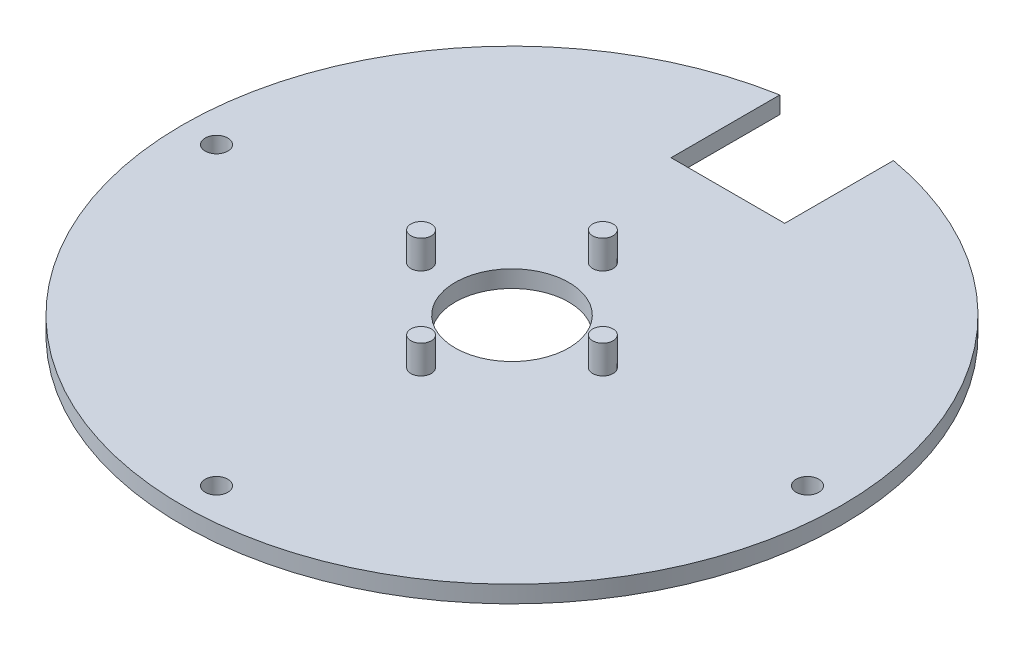
ISO-10303-21;
HEADER;
FILE_DESCRIPTION(('STEP AP214'),'2;1');
FILE_NAME('part.step','',(''),(''),'','','');
FILE_SCHEMA(('AUTOMOTIVE_DESIGN { 1 0 10303 214 1 1 1 1 }'));
ENDSEC;
DATA;
#1=APPLICATION_CONTEXT('core data for automotive mechanical design processes');
#2=APPLICATION_PROTOCOL_DEFINITION('international standard','automotive_design',2000,#1);
#3=PRODUCT_CONTEXT('',#1,'mechanical');
#4=PRODUCT('Part','Part','',(#3));
#5=PRODUCT_RELATED_PRODUCT_CATEGORY('part','',(#4));
#6=PRODUCT_DEFINITION_FORMATION('','',#4);
#7=PRODUCT_DEFINITION_CONTEXT('part definition',#1,'design');
#8=PRODUCT_DEFINITION('design','',#6,#7);
#9=PRODUCT_DEFINITION_SHAPE('','',#8);
#10=(LENGTH_UNIT() NAMED_UNIT(*) SI_UNIT(.MILLI.,.METRE.));
#11=(NAMED_UNIT(*) PLANE_ANGLE_UNIT() SI_UNIT($,.RADIAN.));
#12=(NAMED_UNIT(*) SI_UNIT($,.STERADIAN.) SOLID_ANGLE_UNIT());
#13=UNCERTAINTY_MEASURE_WITH_UNIT(LENGTH_MEASURE(1.E-05),#10,'distance_accuracy_value','');
#14=(GEOMETRIC_REPRESENTATION_CONTEXT(3) GLOBAL_UNCERTAINTY_ASSIGNED_CONTEXT((#13)) GLOBAL_UNIT_ASSIGNED_CONTEXT((#10,
#11,#12)) REPRESENTATION_CONTEXT('',''));
#15=CARTESIAN_POINT('',(0.,0.,0.));
#16=DIRECTION('',(0.,0.,1.));
#17=DIRECTION('',(1.,0.,0.));
#18=AXIS2_PLACEMENT_3D('',#15,#16,#17);
#19=CARTESIAN_POINT('',(0.,5.,0.));
#20=DIRECTION('',(0.,-1.,0.));
#21=DIRECTION('',(0.,0.,-1.));
#22=AXIS2_PLACEMENT_3D('',#19,#20,#21);
#23=CYLINDRICAL_SURFACE('',#22,29.);
#24=CARTESIAN_POINT('',(0.,3.5,0.));
#25=DIRECTION('',(0.,-1.,0.));
#26=DIRECTION('',(0.,0.,-1.));
#27=AXIS2_PLACEMENT_3D('',#24,#25,#26);
#28=CIRCLE('',#27,29.);
#29=CARTESIAN_POINT('',(5.,3.5,-28.5657137141714));
#30=VERTEX_POINT('',#29);
#31=CARTESIAN_POINT('',(-5.,3.5,-28.5657137141714));
#32=VERTEX_POINT('',#31);
#33=EDGE_CURVE('E75',#30,#32,#28,.T.);
#34=ORIENTED_EDGE('',*,*,#33,.F.);
#35=DIRECTION('',(0.,-1.,0.));
#36=VECTOR('',#35,1.);
#37=CARTESIAN_POINT('',(5.,5.,-28.5657137141714));
#38=LINE('',#37,#36);
#39=CARTESIAN_POINT('',(5.,5.,-28.5657137141714));
#40=VERTEX_POINT('',#39);
#41=EDGE_CURVE('E54',#30,#40,#38,.F.);
#42=ORIENTED_EDGE('',*,*,#41,.T.);
#43=CARTESIAN_POINT('',(0.,5.,0.));
#44=DIRECTION('',(0.,1.,0.));
#45=DIRECTION('',(0.,0.,1.));
#46=AXIS2_PLACEMENT_3D('',#43,#44,#45);
#47=CIRCLE('',#46,29.);
#48=CARTESIAN_POINT('',(-5.,5.,-28.5657137141714));
#49=VERTEX_POINT('',#48);
#50=EDGE_CURVE('E40',#49,#40,#47,.T.);
#51=ORIENTED_EDGE('',*,*,#50,.F.);
#52=DIRECTION('',(0.,-1.,0.));
#53=VECTOR('',#52,1.);
#54=CARTESIAN_POINT('',(-5.,5.,-28.5657137141714));
#55=LINE('',#54,#53);
#56=EDGE_CURVE('E81',#49,#32,#55,.T.);
#57=ORIENTED_EDGE('',*,*,#56,.T.);
#58=EDGE_LOOP('',(#34,#42,#51,#57));
#59=FACE_BOUND('',#58,.T.);
#60=ADVANCED_FACE('F33',(#59),#23,.T.);
#61=CARTESIAN_POINT('',(0.,0.,0.));
#62=DIRECTION('',(0.,1.,0.));
#63=DIRECTION('',(0.,0.,1.));
#64=AXIS2_PLACEMENT_3D('',#61,#62,#63);
#65=CYLINDRICAL_SURFACE('',#64,5.);
#66=CARTESIAN_POINT('',(0.,5.,0.));
#67=DIRECTION('',(0.,1.,0.));
#68=DIRECTION('',(0.,0.,1.));
#69=AXIS2_PLACEMENT_3D('',#66,#67,#68);
#70=CIRCLE('',#69,5.);
#71=CARTESIAN_POINT('',(0.,5.,5.));
#72=VERTEX_POINT('',#71);
#73=EDGE_CURVE('E99',#72,#72,#70,.T.);
#74=ORIENTED_EDGE('',*,*,#73,.T.);
#75=EDGE_LOOP('',(#74));
#76=FACE_BOUND('',#75,.T.);
#77=CARTESIAN_POINT('',(0.,3.5,0.));
#78=DIRECTION('',(0.,-1.,0.));
#79=DIRECTION('',(0.,0.,-1.));
#80=AXIS2_PLACEMENT_3D('',#77,#78,#79);
#81=CIRCLE('',#80,5.);
#82=CARTESIAN_POINT('',(0.,3.5,-5.));
#83=VERTEX_POINT('',#82);
#84=EDGE_CURVE('E141',#83,#83,#81,.F.);
#85=ORIENTED_EDGE('',*,*,#84,.F.);
#86=EDGE_LOOP('',(#85));
#87=FACE_BOUND('',#86,.T.);
#88=ADVANCED_FACE('F161',(#76,#87),#65,.F.);
#89=CARTESIAN_POINT('',(26.,0.,0.));
#90=DIRECTION('',(0.,1.,0.));
#91=DIRECTION('',(0.,0.,1.));
#92=AXIS2_PLACEMENT_3D('',#89,#90,#91);
#93=CYLINDRICAL_SURFACE('',#92,1.);
#94=CARTESIAN_POINT('',(26.,5.,0.));
#95=DIRECTION('',(0.,1.,0.));
#96=DIRECTION('',(0.,0.,1.));
#97=AXIS2_PLACEMENT_3D('',#94,#95,#96);
#98=CIRCLE('',#97,1.);
#99=CARTESIAN_POINT('',(26.,5.,1.));
#100=VERTEX_POINT('',#99);
#101=EDGE_CURVE('E87',#100,#100,#98,.T.);
#102=ORIENTED_EDGE('',*,*,#101,.T.);
#103=EDGE_LOOP('',(#102));
#104=FACE_BOUND('',#103,.T.);
#105=CARTESIAN_POINT('',(26.,3.5,0.));
#106=DIRECTION('',(0.,-1.,0.));
#107=DIRECTION('',(0.,0.,-1.));
#108=AXIS2_PLACEMENT_3D('',#105,#106,#107);
#109=CIRCLE('',#108,1.);
#110=CARTESIAN_POINT('',(26.,3.5,-1.));
#111=VERTEX_POINT('',#110);
#112=EDGE_CURVE('E155',#111,#111,#109,.F.);
#113=ORIENTED_EDGE('',*,*,#112,.F.);
#114=EDGE_LOOP('',(#113));
#115=FACE_BOUND('',#114,.T.);
#116=ADVANCED_FACE('F163',(#104,#115),#93,.F.);
#117=CARTESIAN_POINT('',(0.,0.,26.));
#118=DIRECTION('',(0.,1.,0.));
#119=DIRECTION('',(0.,0.,1.));
#120=AXIS2_PLACEMENT_3D('',#117,#118,#119);
#121=CYLINDRICAL_SURFACE('',#120,1.);
#122=CARTESIAN_POINT('',(0.,5.,26.));
#123=DIRECTION('',(0.,1.,0.));
#124=DIRECTION('',(0.,0.,1.));
#125=AXIS2_PLACEMENT_3D('',#122,#123,#124);
#126=CIRCLE('',#125,1.);
#127=CARTESIAN_POINT('',(0.,5.,27.));
#128=VERTEX_POINT('',#127);
#129=EDGE_CURVE('E90',#128,#128,#126,.T.);
#130=ORIENTED_EDGE('',*,*,#129,.T.);
#131=EDGE_LOOP('',(#130));
#132=FACE_BOUND('',#131,.T.);
#133=CARTESIAN_POINT('',(0.,3.5,26.));
#134=DIRECTION('',(0.,-1.,0.));
#135=DIRECTION('',(0.,0.,-1.));
#136=AXIS2_PLACEMENT_3D('',#133,#134,#135);
#137=CIRCLE('',#136,1.);
#138=CARTESIAN_POINT('',(0.,3.5,25.));
#139=VERTEX_POINT('',#138);
#140=EDGE_CURVE('E152',#139,#139,#137,.F.);
#141=ORIENTED_EDGE('',*,*,#140,.F.);
#142=EDGE_LOOP('',(#141));
#143=FACE_BOUND('',#142,.T.);
#144=ADVANCED_FACE('F170',(#132,#143),#121,.F.);
#145=CARTESIAN_POINT('',(-26.,0.,0.));
#146=DIRECTION('',(0.,1.,0.));
#147=DIRECTION('',(0.,0.,1.));
#148=AXIS2_PLACEMENT_3D('',#145,#146,#147);
#149=CYLINDRICAL_SURFACE('',#148,1.);
#150=CARTESIAN_POINT('',(-26.,5.,0.));
#151=DIRECTION('',(0.,1.,0.));
#152=DIRECTION('',(0.,0.,1.));
#153=AXIS2_PLACEMENT_3D('',#150,#151,#152);
#154=CIRCLE('',#153,1.);
#155=CARTESIAN_POINT('',(-26.,5.,1.));
#156=VERTEX_POINT('',#155);
#157=EDGE_CURVE('E96',#156,#156,#154,.T.);
#158=ORIENTED_EDGE('',*,*,#157,.T.);
#159=EDGE_LOOP('',(#158));
#160=FACE_BOUND('',#159,.T.);
#161=CARTESIAN_POINT('',(-26.,3.5,0.));
#162=DIRECTION('',(0.,-1.,0.));
#163=DIRECTION('',(0.,0.,-1.));
#164=AXIS2_PLACEMENT_3D('',#161,#162,#163);
#165=CIRCLE('',#164,1.);
#166=CARTESIAN_POINT('',(-26.,3.5,-0.999999999999998));
#167=VERTEX_POINT('',#166);
#168=EDGE_CURVE('E78',#167,#167,#165,.F.);
#169=ORIENTED_EDGE('',*,*,#168,.F.);
#170=EDGE_LOOP('',(#169));
#171=FACE_BOUND('',#170,.T.);
#172=ADVANCED_FACE('F219',(#160,#171),#149,.F.);
#173=CARTESIAN_POINT('',(5.,-5.,-19.));
#174=DIRECTION('',(1.,0.,0.));
#175=DIRECTION('',(0.,0.,-1.));
#176=AXIS2_PLACEMENT_3D('',#173,#174,#175);
#177=PLANE('',#176);
#178=DIRECTION('',(0.,0.,-1.));
#179=VECTOR('',#178,1.);
#180=CARTESIAN_POINT('',(5.,3.5,-19.));
#181=LINE('',#180,#179);
#182=CARTESIAN_POINT('',(5.,3.5,-19.));
#183=VERTEX_POINT('',#182);
#184=EDGE_CURVE('E72',#183,#30,#181,.T.);
#185=ORIENTED_EDGE('',*,*,#184,.F.);
#186=DIRECTION('',(0.,1.,0.));
#187=VECTOR('',#186,1.);
#188=CARTESIAN_POINT('',(5.,-5.,-19.));
#189=LINE('',#188,#187);
#190=CARTESIAN_POINT('',(5.,5.,-19.));
#191=VERTEX_POINT('',#190);
#192=EDGE_CURVE('E92',#183,#191,#189,.T.);
#193=ORIENTED_EDGE('',*,*,#192,.T.);
#194=DIRECTION('',(0.,0.,-1.));
#195=VECTOR('',#194,1.);
#196=CARTESIAN_POINT('',(5.,5.,-19.));
#197=LINE('',#196,#195);
#198=EDGE_CURVE('E85',#191,#40,#197,.T.);
#199=ORIENTED_EDGE('',*,*,#198,.T.);
#200=ORIENTED_EDGE('',*,*,#41,.F.);
#201=EDGE_LOOP('',(#185,#193,#199,#200));
#202=FACE_BOUND('',#201,.T.);
#203=ADVANCED_FACE('F83',(#202),#177,.F.);
#204=CARTESIAN_POINT('',(-5.,-5.,-29.));
#205=DIRECTION('',(-1.,0.,0.));
#206=DIRECTION('',(0.,0.,1.));
#207=AXIS2_PLACEMENT_3D('',#204,#205,#206);
#208=PLANE('',#207);
#209=DIRECTION('',(0.,0.,1.));
#210=VECTOR('',#209,1.);
#211=CARTESIAN_POINT('',(-5.,3.5,-29.));
#212=LINE('',#211,#210);
#213=CARTESIAN_POINT('',(-5.,3.5,-19.));
#214=VERTEX_POINT('',#213);
#215=EDGE_CURVE('E46',#32,#214,#212,.T.);
#216=ORIENTED_EDGE('',*,*,#215,.F.);
#217=ORIENTED_EDGE('',*,*,#56,.F.);
#218=DIRECTION('',(0.,0.,1.));
#219=VECTOR('',#218,1.);
#220=CARTESIAN_POINT('',(-5.,5.,-29.));
#221=LINE('',#220,#219);
#222=CARTESIAN_POINT('',(-5.,5.,-19.));
#223=VERTEX_POINT('',#222);
#224=EDGE_CURVE('E133',#49,#223,#221,.T.);
#225=ORIENTED_EDGE('',*,*,#224,.T.);
#226=DIRECTION('',(0.,1.,0.));
#227=VECTOR('',#226,1.);
#228=CARTESIAN_POINT('',(-5.,-5.,-19.));
#229=LINE('',#228,#227);
#230=EDGE_CURVE('E139',#214,#223,#229,.T.);
#231=ORIENTED_EDGE('',*,*,#230,.F.);
#232=EDGE_LOOP('',(#216,#217,#225,#231));
#233=FACE_BOUND('',#232,.T.);
#234=ADVANCED_FACE('F147',(#233),#208,.F.);
#235=CARTESIAN_POINT('',(-5.,-5.,-19.));
#236=DIRECTION('',(0.,0.,1.));
#237=DIRECTION('',(1.,0.,0.));
#238=AXIS2_PLACEMENT_3D('',#235,#236,#237);
#239=PLANE('',#238);
#240=DIRECTION('',(1.,0.,0.));
#241=VECTOR('',#240,1.);
#242=CARTESIAN_POINT('',(-5.,3.5,-19.));
#243=LINE('',#242,#241);
#244=EDGE_CURVE('E11',#214,#183,#243,.T.);
#245=ORIENTED_EDGE('',*,*,#244,.F.);
#246=ORIENTED_EDGE('',*,*,#230,.T.);
#247=DIRECTION('',(1.,0.,0.));
#248=VECTOR('',#247,1.);
#249=CARTESIAN_POINT('',(-5.,5.,-19.));
#250=LINE('',#249,#248);
#251=EDGE_CURVE('E135',#223,#191,#250,.T.);
#252=ORIENTED_EDGE('',*,*,#251,.T.);
#253=ORIENTED_EDGE('',*,*,#192,.F.);
#254=EDGE_LOOP('',(#245,#246,#252,#253));
#255=FACE_BOUND('',#254,.T.);
#256=ADVANCED_FACE('F146',(#255),#239,.F.);
#257=CARTESIAN_POINT('',(0.,5.,0.));
#258=DIRECTION('',(0.,1.,0.));
#259=DIRECTION('',(0.,0.,1.));
#260=AXIS2_PLACEMENT_3D('',#257,#258,#259);
#261=PLANE('',#260);
#262=ORIENTED_EDGE('',*,*,#198,.F.);
#263=ORIENTED_EDGE('',*,*,#251,.F.);
#264=ORIENTED_EDGE('',*,*,#224,.F.);
#265=ORIENTED_EDGE('',*,*,#50,.T.);
#266=EDGE_LOOP('',(#262,#263,#264,#265));
#267=FACE_BOUND('',#266,.T.);
#268=ORIENTED_EDGE('',*,*,#157,.F.);
#269=EDGE_LOOP('',(#268));
#270=FACE_BOUND('',#269,.T.);
#271=ORIENTED_EDGE('',*,*,#129,.F.);
#272=EDGE_LOOP('',(#271));
#273=FACE_BOUND('',#272,.T.);
#274=ORIENTED_EDGE('',*,*,#101,.F.);
#275=EDGE_LOOP('',(#274));
#276=FACE_BOUND('',#275,.T.);
#277=ORIENTED_EDGE('',*,*,#73,.F.);
#278=EDGE_LOOP('',(#277));
#279=FACE_BOUND('',#278,.T.);
#280=CARTESIAN_POINT('',(0.,5.,8.));
#281=DIRECTION('',(0.,1.,0.));
#282=DIRECTION('',(0.,0.,1.));
#283=AXIS2_PLACEMENT_3D('',#280,#281,#282);
#284=CIRCLE('',#283,0.9);
#285=CARTESIAN_POINT('',(0.,5.,8.9));
#286=VERTEX_POINT('',#285);
#287=EDGE_CURVE('E104',#286,#286,#284,.T.);
#288=ORIENTED_EDGE('',*,*,#287,.F.);
#289=EDGE_LOOP('',(#288));
#290=FACE_BOUND('',#289,.T.);
#291=CARTESIAN_POINT('',(0.,5.,-8.));
#292=DIRECTION('',(0.,1.,0.));
#293=DIRECTION('',(0.,0.,1.));
#294=AXIS2_PLACEMENT_3D('',#291,#292,#293);
#295=CIRCLE('',#294,0.9);
#296=CARTESIAN_POINT('',(0.,5.,-7.1));
#297=VERTEX_POINT('',#296);
#298=EDGE_CURVE('E108',#297,#297,#295,.T.);
#299=ORIENTED_EDGE('',*,*,#298,.F.);
#300=EDGE_LOOP('',(#299));
#301=FACE_BOUND('',#300,.T.);
#302=CARTESIAN_POINT('',(-8.,5.,0.));
#303=DIRECTION('',(0.,1.,0.));
#304=DIRECTION('',(0.,0.,1.));
#305=AXIS2_PLACEMENT_3D('',#302,#303,#304);
#306=CIRCLE('',#305,0.899999999999999);
#307=CARTESIAN_POINT('',(-8.,5.,0.9));
#308=VERTEX_POINT('',#307);
#309=EDGE_CURVE('E114',#308,#308,#306,.T.);
#310=ORIENTED_EDGE('',*,*,#309,.F.);
#311=EDGE_LOOP('',(#310));
#312=FACE_BOUND('',#311,.T.);
#313=CARTESIAN_POINT('',(8.,5.,0.));
#314=DIRECTION('',(0.,1.,0.));
#315=DIRECTION('',(0.,0.,1.));
#316=AXIS2_PLACEMENT_3D('',#313,#314,#315);
#317=CIRCLE('',#316,0.9);
#318=CARTESIAN_POINT('',(8.,5.,0.9));
#319=VERTEX_POINT('',#318);
#320=EDGE_CURVE('E120',#319,#319,#317,.T.);
#321=ORIENTED_EDGE('',*,*,#320,.F.);
#322=EDGE_LOOP('',(#321));
#323=FACE_BOUND('',#322,.T.);
#324=ADVANCED_FACE('F129',(#267,#270,#273,#276,#279,#290,#301,#312,#323),#261,.T.);
#325=CARTESIAN_POINT('',(8.,7.5,0.));
#326=DIRECTION('',(0.,-1.,0.));
#327=DIRECTION('',(0.,0.,-1.));
#328=AXIS2_PLACEMENT_3D('',#325,#326,#327);
#329=CYLINDRICAL_SURFACE('',#328,0.9);
#330=CARTESIAN_POINT('',(8.,7.5,0.));
#331=DIRECTION('',(0.,1.,0.));
#332=DIRECTION('',(0.,0.,1.));
#333=AXIS2_PLACEMENT_3D('',#330,#331,#332);
#334=CIRCLE('',#333,0.9);
#335=CARTESIAN_POINT('',(8.,7.5,0.9));
#336=VERTEX_POINT('',#335);
#337=EDGE_CURVE('E123',#336,#336,#334,.T.);
#338=ORIENTED_EDGE('',*,*,#337,.F.);
#339=EDGE_LOOP('',(#338));
#340=FACE_BOUND('',#339,.T.);
#341=ORIENTED_EDGE('',*,*,#320,.T.);
#342=EDGE_LOOP('',(#341));
#343=FACE_BOUND('',#342,.T.);
#344=ADVANCED_FACE('F202',(#340,#343),#329,.T.);
#345=CARTESIAN_POINT('',(8.,7.5,0.));
#346=DIRECTION('',(0.,1.,0.));
#347=DIRECTION('',(0.,0.,1.));
#348=AXIS2_PLACEMENT_3D('',#345,#346,#347);
#349=PLANE('',#348);
#350=ORIENTED_EDGE('',*,*,#337,.T.);
#351=EDGE_LOOP('',(#350));
#352=FACE_BOUND('',#351,.T.);
#353=ADVANCED_FACE('F198',(#352),#349,.T.);
#354=CARTESIAN_POINT('',(-8.,7.5,0.));
#355=DIRECTION('',(0.,-1.,0.));
#356=DIRECTION('',(0.,0.,-1.));
#357=AXIS2_PLACEMENT_3D('',#354,#355,#356);
#358=CYLINDRICAL_SURFACE('',#357,0.899999999999999);
#359=CARTESIAN_POINT('',(-8.,7.5,0.));
#360=DIRECTION('',(0.,1.,0.));
#361=DIRECTION('',(0.,0.,1.));
#362=AXIS2_PLACEMENT_3D('',#359,#360,#361);
#363=CIRCLE('',#362,0.899999999999999);
#364=CARTESIAN_POINT('',(-8.,7.5,0.9));
#365=VERTEX_POINT('',#364);
#366=EDGE_CURVE('E117',#365,#365,#363,.T.);
#367=ORIENTED_EDGE('',*,*,#366,.F.);
#368=EDGE_LOOP('',(#367));
#369=FACE_BOUND('',#368,.T.);
#370=ORIENTED_EDGE('',*,*,#309,.T.);
#371=EDGE_LOOP('',(#370));
#372=FACE_BOUND('',#371,.T.);
#373=ADVANCED_FACE('F194',(#369,#372),#358,.T.);
#374=CARTESIAN_POINT('',(-8.,7.5,0.));
#375=DIRECTION('',(0.,1.,0.));
#376=DIRECTION('',(0.,0.,1.));
#377=AXIS2_PLACEMENT_3D('',#374,#375,#376);
#378=PLANE('',#377);
#379=ORIENTED_EDGE('',*,*,#366,.T.);
#380=EDGE_LOOP('',(#379));
#381=FACE_BOUND('',#380,.T.);
#382=ADVANCED_FACE('F190',(#381),#378,.T.);
#383=CARTESIAN_POINT('',(0.,7.5,-8.));
#384=DIRECTION('',(0.,-1.,0.));
#385=DIRECTION('',(0.,0.,-1.));
#386=AXIS2_PLACEMENT_3D('',#383,#384,#385);
#387=CYLINDRICAL_SURFACE('',#386,0.9);
#388=CARTESIAN_POINT('',(0.,7.5,-8.));
#389=DIRECTION('',(0.,1.,0.));
#390=DIRECTION('',(0.,0.,1.));
#391=AXIS2_PLACEMENT_3D('',#388,#389,#390);
#392=CIRCLE('',#391,0.9);
#393=CARTESIAN_POINT('',(0.,7.5,-7.1));
#394=VERTEX_POINT('',#393);
#395=EDGE_CURVE('E111',#394,#394,#392,.T.);
#396=ORIENTED_EDGE('',*,*,#395,.F.);
#397=EDGE_LOOP('',(#396));
#398=FACE_BOUND('',#397,.T.);
#399=ORIENTED_EDGE('',*,*,#298,.T.);
#400=EDGE_LOOP('',(#399));
#401=FACE_BOUND('',#400,.T.);
#402=ADVANCED_FACE('F186',(#398,#401),#387,.T.);
#403=CARTESIAN_POINT('',(0.,7.5,-8.));
#404=DIRECTION('',(0.,1.,0.));
#405=DIRECTION('',(0.,0.,1.));
#406=AXIS2_PLACEMENT_3D('',#403,#404,#405);
#407=PLANE('',#406);
#408=ORIENTED_EDGE('',*,*,#395,.T.);
#409=EDGE_LOOP('',(#408));
#410=FACE_BOUND('',#409,.T.);
#411=ADVANCED_FACE('F182',(#410),#407,.T.);
#412=CARTESIAN_POINT('',(0.,7.5,8.));
#413=DIRECTION('',(0.,-1.,0.));
#414=DIRECTION('',(0.,0.,-1.));
#415=AXIS2_PLACEMENT_3D('',#412,#413,#414);
#416=CYLINDRICAL_SURFACE('',#415,0.9);
#417=CARTESIAN_POINT('',(0.,7.5,8.));
#418=DIRECTION('',(0.,1.,0.));
#419=DIRECTION('',(0.,0.,1.));
#420=AXIS2_PLACEMENT_3D('',#417,#418,#419);
#421=CIRCLE('',#420,0.9);
#422=CARTESIAN_POINT('',(0.,7.5,8.9));
#423=VERTEX_POINT('',#422);
#424=EDGE_CURVE('E105',#423,#423,#421,.T.);
#425=ORIENTED_EDGE('',*,*,#424,.F.);
#426=EDGE_LOOP('',(#425));
#427=FACE_BOUND('',#426,.T.);
#428=ORIENTED_EDGE('',*,*,#287,.T.);
#429=EDGE_LOOP('',(#428));
#430=FACE_BOUND('',#429,.T.);
#431=ADVANCED_FACE('F178',(#427,#430),#416,.T.);
#432=CARTESIAN_POINT('',(0.,7.5,8.));
#433=DIRECTION('',(0.,1.,0.));
#434=DIRECTION('',(0.,0.,1.));
#435=AXIS2_PLACEMENT_3D('',#432,#433,#434);
#436=PLANE('',#435);
#437=ORIENTED_EDGE('',*,*,#424,.T.);
#438=EDGE_LOOP('',(#437));
#439=FACE_BOUND('',#438,.T.);
#440=ADVANCED_FACE('F175',(#439),#436,.T.);
#441=CARTESIAN_POINT('',(0.,3.5,0.));
#442=DIRECTION('',(0.,-1.,0.));
#443=DIRECTION('',(0.,0.,-1.));
#444=AXIS2_PLACEMENT_3D('',#441,#442,#443);
#445=PLANE('',#444);
#446=ORIENTED_EDGE('',*,*,#184,.T.);
#447=ORIENTED_EDGE('',*,*,#33,.T.);
#448=ORIENTED_EDGE('',*,*,#215,.T.);
#449=ORIENTED_EDGE('',*,*,#244,.T.);
#450=EDGE_LOOP('',(#446,#447,#448,#449));
#451=FACE_BOUND('',#450,.T.);
#452=ORIENTED_EDGE('',*,*,#168,.T.);
#453=EDGE_LOOP('',(#452));
#454=FACE_BOUND('',#453,.T.);
#455=ORIENTED_EDGE('',*,*,#140,.T.);
#456=EDGE_LOOP('',(#455));
#457=FACE_BOUND('',#456,.T.);
#458=ORIENTED_EDGE('',*,*,#112,.T.);
#459=EDGE_LOOP('',(#458));
#460=FACE_BOUND('',#459,.T.);
#461=ORIENTED_EDGE('',*,*,#84,.T.);
#462=EDGE_LOOP('',(#461));
#463=FACE_BOUND('',#462,.T.);
#464=ADVANCED_FACE('F73',(#451,#454,#457,#460,#463),#445,.T.);
#465=CLOSED_SHELL('',(#60,#88,#116,#144,#172,#203,#234,#256,#324,#344,#353,#373,#382,#402,#411,
#431,#440,#464));
#466=MANIFOLD_SOLID_BREP('B2',#465);
#467=ADVANCED_BREP_SHAPE_REPRESENTATION('',(#18,#466),#14);
#468=SHAPE_DEFINITION_REPRESENTATION(#9,#467);
ENDSEC;
END-ISO-10303-21;
